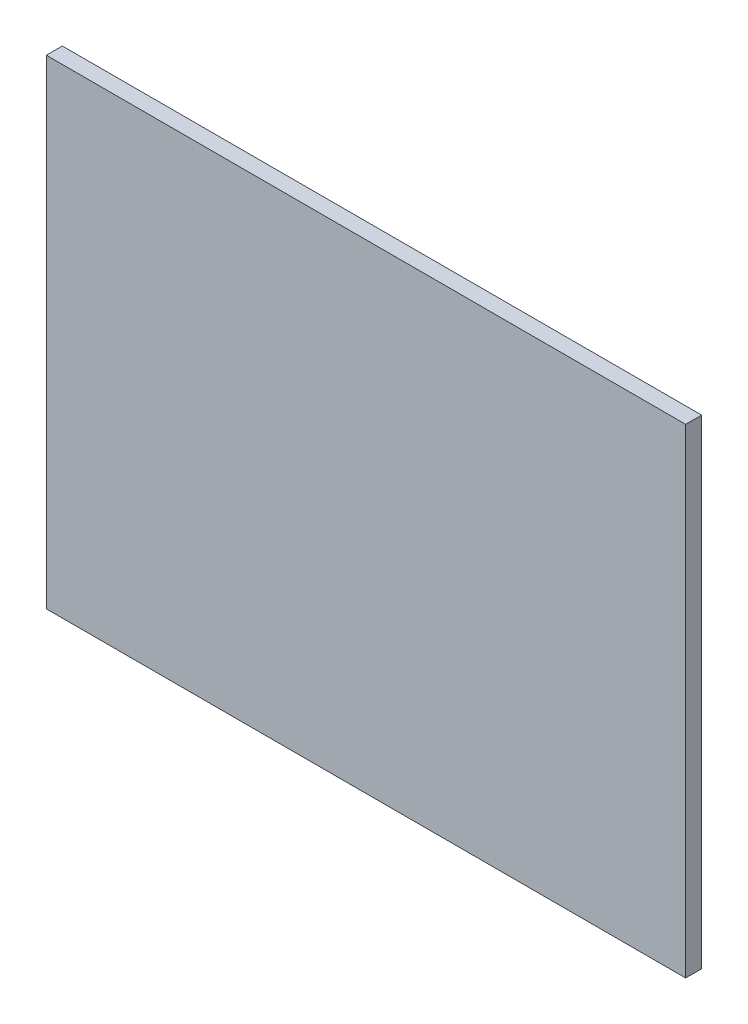
ISO-10303-21;
HEADER;
FILE_DESCRIPTION(('STEP AP214'),'2;1');
FILE_NAME('part.step','',(''),(''),'','','');
FILE_SCHEMA(('AUTOMOTIVE_DESIGN { 1 0 10303 214 1 1 1 1 }'));
ENDSEC;
DATA;
#1=APPLICATION_CONTEXT('core data for automotive mechanical design processes');
#2=APPLICATION_PROTOCOL_DEFINITION('international standard','automotive_design',2000,#1);
#3=PRODUCT_CONTEXT('',#1,'mechanical');
#4=PRODUCT('Part','Part','',(#3));
#5=PRODUCT_RELATED_PRODUCT_CATEGORY('part','',(#4));
#6=PRODUCT_DEFINITION_FORMATION('','',#4);
#7=PRODUCT_DEFINITION_CONTEXT('part definition',#1,'design');
#8=PRODUCT_DEFINITION('design','',#6,#7);
#9=PRODUCT_DEFINITION_SHAPE('','',#8);
#10=(LENGTH_UNIT() NAMED_UNIT(*) SI_UNIT(.MILLI.,.METRE.));
#11=(NAMED_UNIT(*) PLANE_ANGLE_UNIT() SI_UNIT($,.RADIAN.));
#12=(NAMED_UNIT(*) SI_UNIT($,.STERADIAN.) SOLID_ANGLE_UNIT());
#13=UNCERTAINTY_MEASURE_WITH_UNIT(LENGTH_MEASURE(1.E-05),#10,'distance_accuracy_value','');
#14=(GEOMETRIC_REPRESENTATION_CONTEXT(3) GLOBAL_UNCERTAINTY_ASSIGNED_CONTEXT((#13)) GLOBAL_UNIT_ASSIGNED_CONTEXT((#10,
#11,#12)) REPRESENTATION_CONTEXT('',''));
#15=CARTESIAN_POINT('',(0.,0.,0.));
#16=DIRECTION('',(0.,0.,1.));
#17=DIRECTION('',(1.,0.,0.));
#18=AXIS2_PLACEMENT_3D('',#15,#16,#17);
#19=CARTESIAN_POINT('',(-100.,75.,5.));
#20=DIRECTION('',(1.,0.,0.));
#21=DIRECTION('',(0.,1.,0.));
#22=AXIS2_PLACEMENT_3D('',#19,#20,#21);
#23=PLANE('',#22);
#24=DIRECTION('',(0.,-1.,0.));
#25=VECTOR('',#24,1.);
#26=CARTESIAN_POINT('',(-100.,75.,0.));
#27=LINE('',#26,#25);
#28=CARTESIAN_POINT('',(-100.,75.,0.));
#29=VERTEX_POINT('',#28);
#30=CARTESIAN_POINT('',(-100.,-75.,0.));
#31=VERTEX_POINT('',#30);
#32=EDGE_CURVE('E100',#29,#31,#27,.T.);
#33=ORIENTED_EDGE('',*,*,#32,.T.);
#34=DIRECTION('',(0.,0.,-1.));
#35=VECTOR('',#34,1.);
#36=CARTESIAN_POINT('',(-100.,-75.,5.));
#37=LINE('',#36,#35);
#38=CARTESIAN_POINT('',(-100.,-75.,5.));
#39=VERTEX_POINT('',#38);
#40=EDGE_CURVE('E11',#39,#31,#37,.T.);
#41=ORIENTED_EDGE('',*,*,#40,.F.);
#42=DIRECTION('',(0.,-1.,0.));
#43=VECTOR('',#42,1.);
#44=CARTESIAN_POINT('',(-100.,75.,5.));
#45=LINE('',#44,#43);
#46=CARTESIAN_POINT('',(-100.,75.,5.));
#47=VERTEX_POINT('',#46);
#48=EDGE_CURVE('E88',#47,#39,#45,.T.);
#49=ORIENTED_EDGE('',*,*,#48,.F.);
#50=DIRECTION('',(0.,0.,-1.));
#51=VECTOR('',#50,1.);
#52=CARTESIAN_POINT('',(-100.,75.,5.));
#53=LINE('',#52,#51);
#54=EDGE_CURVE('E96',#47,#29,#53,.T.);
#55=ORIENTED_EDGE('',*,*,#54,.T.);
#56=EDGE_LOOP('',(#33,#41,#49,#55));
#57=FACE_BOUND('',#56,.T.);
#58=ADVANCED_FACE('F37',(#57),#23,.F.);
#59=CARTESIAN_POINT('',(-100.,-75.,5.));
#60=DIRECTION('',(0.,1.,0.));
#61=DIRECTION('',(0.,0.,1.));
#62=AXIS2_PLACEMENT_3D('',#59,#60,#61);
#63=PLANE('',#62);
#64=DIRECTION('',(1.,0.,0.));
#65=VECTOR('',#64,1.);
#66=CARTESIAN_POINT('',(-100.,-75.,0.));
#67=LINE('',#66,#65);
#68=CARTESIAN_POINT('',(100.,-75.,0.));
#69=VERTEX_POINT('',#68);
#70=EDGE_CURVE('E92',#31,#69,#67,.T.);
#71=ORIENTED_EDGE('',*,*,#70,.T.);
#72=DIRECTION('',(0.,0.,-1.));
#73=VECTOR('',#72,1.);
#74=CARTESIAN_POINT('',(100.,-75.,5.));
#75=LINE('',#74,#73);
#76=CARTESIAN_POINT('',(100.,-75.,5.));
#77=VERTEX_POINT('',#76);
#78=EDGE_CURVE('E45',#77,#69,#75,.T.);
#79=ORIENTED_EDGE('',*,*,#78,.F.);
#80=DIRECTION('',(1.,0.,0.));
#81=VECTOR('',#80,1.);
#82=CARTESIAN_POINT('',(-100.,-75.,5.));
#83=LINE('',#82,#81);
#84=EDGE_CURVE('E83',#39,#77,#83,.T.);
#85=ORIENTED_EDGE('',*,*,#84,.F.);
#86=ORIENTED_EDGE('',*,*,#40,.T.);
#87=EDGE_LOOP('',(#71,#79,#85,#86));
#88=FACE_BOUND('',#87,.T.);
#89=ADVANCED_FACE('F91',(#88),#63,.F.);
#90=CARTESIAN_POINT('',(100.,75.,5.));
#91=DIRECTION('',(-1.,0.,0.));
#92=DIRECTION('',(0.,-1.,0.));
#93=AXIS2_PLACEMENT_3D('',#90,#91,#92);
#94=PLANE('',#93);
#95=DIRECTION('',(0.,1.,0.));
#96=VECTOR('',#95,1.);
#97=CARTESIAN_POINT('',(100.,75.,0.));
#98=LINE('',#97,#96);
#99=CARTESIAN_POINT('',(100.,75.,0.));
#100=VERTEX_POINT('',#99);
#101=EDGE_CURVE('E70',#69,#100,#98,.T.);
#102=ORIENTED_EDGE('',*,*,#101,.T.);
#103=DIRECTION('',(0.,0.,-1.));
#104=VECTOR('',#103,1.);
#105=CARTESIAN_POINT('',(100.,75.,5.));
#106=LINE('',#105,#104);
#107=CARTESIAN_POINT('',(100.,75.,5.));
#108=VERTEX_POINT('',#107);
#109=EDGE_CURVE('E93',#108,#100,#106,.T.);
#110=ORIENTED_EDGE('',*,*,#109,.F.);
#111=DIRECTION('',(0.,1.,0.));
#112=VECTOR('',#111,1.);
#113=CARTESIAN_POINT('',(100.,75.,5.));
#114=LINE('',#113,#112);
#115=EDGE_CURVE('E86',#77,#108,#114,.T.);
#116=ORIENTED_EDGE('',*,*,#115,.F.);
#117=ORIENTED_EDGE('',*,*,#78,.T.);
#118=EDGE_LOOP('',(#102,#110,#116,#117));
#119=FACE_BOUND('',#118,.T.);
#120=ADVANCED_FACE('F94',(#119),#94,.F.);
#121=CARTESIAN_POINT('',(-100.,75.,5.));
#122=DIRECTION('',(0.,-1.,0.));
#123=DIRECTION('',(0.,0.,-1.));
#124=AXIS2_PLACEMENT_3D('',#121,#122,#123);
#125=PLANE('',#124);
#126=DIRECTION('',(-1.,0.,0.));
#127=VECTOR('',#126,1.);
#128=CARTESIAN_POINT('',(-100.,75.,0.));
#129=LINE('',#128,#127);
#130=EDGE_CURVE('E76',#100,#29,#129,.T.);
#131=ORIENTED_EDGE('',*,*,#130,.T.);
#132=ORIENTED_EDGE('',*,*,#54,.F.);
#133=DIRECTION('',(-1.,0.,0.));
#134=VECTOR('',#133,1.);
#135=CARTESIAN_POINT('',(-100.,75.,5.));
#136=LINE('',#135,#134);
#137=EDGE_CURVE('E53',#108,#47,#136,.T.);
#138=ORIENTED_EDGE('',*,*,#137,.F.);
#139=ORIENTED_EDGE('',*,*,#109,.T.);
#140=EDGE_LOOP('',(#131,#132,#138,#139));
#141=FACE_BOUND('',#140,.T.);
#142=ADVANCED_FACE('F107',(#141),#125,.F.);
#143=CARTESIAN_POINT('',(0.,0.,5.));
#144=DIRECTION('',(0.,0.,1.));
#145=DIRECTION('',(1.,0.,0.));
#146=AXIS2_PLACEMENT_3D('',#143,#144,#145);
#147=PLANE('',#146);
#148=ORIENTED_EDGE('',*,*,#48,.T.);
#149=ORIENTED_EDGE('',*,*,#84,.T.);
#150=ORIENTED_EDGE('',*,*,#115,.T.);
#151=ORIENTED_EDGE('',*,*,#137,.T.);
#152=EDGE_LOOP('',(#148,#149,#150,#151));
#153=FACE_BOUND('',#152,.T.);
#154=ADVANCED_FACE('F84',(#153),#147,.T.);
#155=CARTESIAN_POINT('',(0.,0.,0.));
#156=DIRECTION('',(0.,0.,1.));
#157=DIRECTION('',(1.,0.,0.));
#158=AXIS2_PLACEMENT_3D('',#155,#156,#157);
#159=PLANE('',#158);
#160=ORIENTED_EDGE('',*,*,#32,.F.);
#161=ORIENTED_EDGE('',*,*,#130,.F.);
#162=ORIENTED_EDGE('',*,*,#101,.F.);
#163=ORIENTED_EDGE('',*,*,#70,.F.);
#164=EDGE_LOOP('',(#160,#161,#162,#163));
#165=FACE_BOUND('',#164,.T.);
#166=ADVANCED_FACE('F110',(#165),#159,.F.);
#167=CLOSED_SHELL('',(#58,#89,#120,#142,#154,#166));
#168=MANIFOLD_SOLID_BREP('B2',#167);
#169=ADVANCED_BREP_SHAPE_REPRESENTATION('',(#18,#168),#14);
#170=SHAPE_DEFINITION_REPRESENTATION(#9,#169);
ENDSEC;
END-ISO-10303-21;
